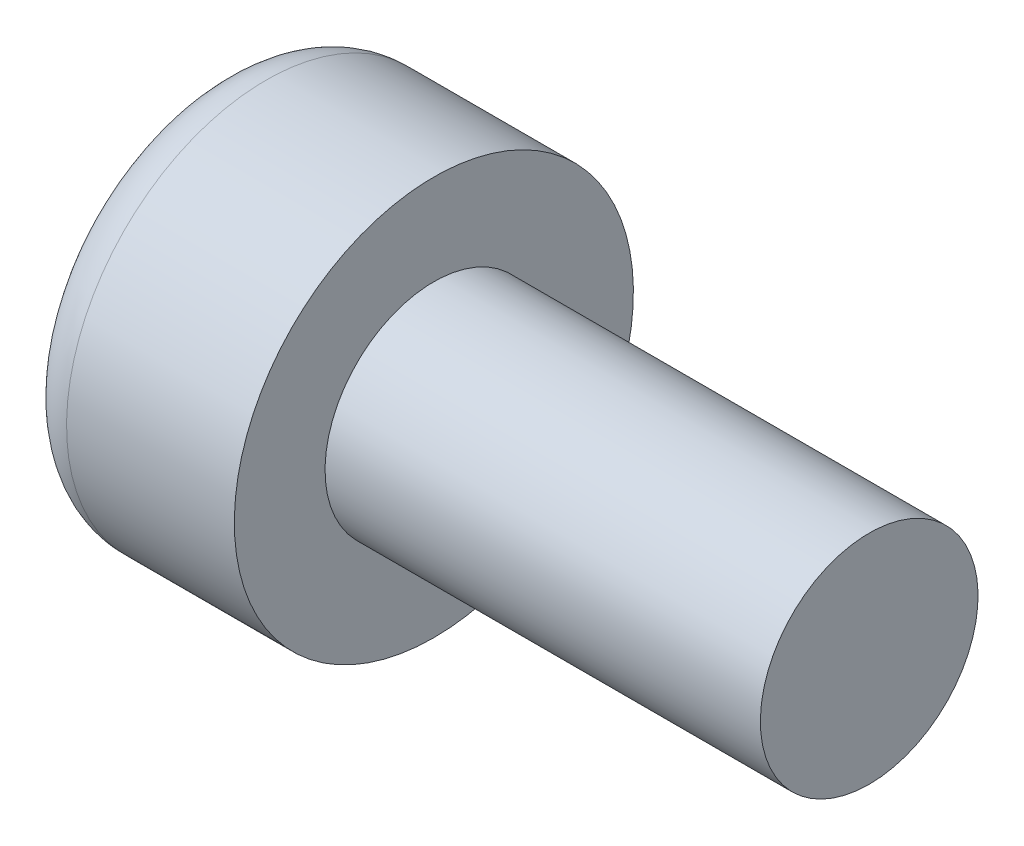
ISO-10303-21;
HEADER;
FILE_DESCRIPTION(('STEP AP214'),'2;1');
FILE_NAME('part.step','',(''),(''),'','','');
FILE_SCHEMA(('AUTOMOTIVE_DESIGN { 1 0 10303 214 1 1 1 1 }'));
ENDSEC;
DATA;
#1=APPLICATION_CONTEXT('core data for automotive mechanical design processes');
#2=APPLICATION_PROTOCOL_DEFINITION('international standard','automotive_design',2000,#1);
#3=PRODUCT_CONTEXT('',#1,'mechanical');
#4=PRODUCT('Part','Part','',(#3));
#5=PRODUCT_RELATED_PRODUCT_CATEGORY('part','',(#4));
#6=PRODUCT_DEFINITION_FORMATION('','',#4);
#7=PRODUCT_DEFINITION_CONTEXT('part definition',#1,'design');
#8=PRODUCT_DEFINITION('design','',#6,#7);
#9=PRODUCT_DEFINITION_SHAPE('','',#8);
#10=(LENGTH_UNIT() NAMED_UNIT(*) SI_UNIT(.MILLI.,.METRE.));
#11=(NAMED_UNIT(*) PLANE_ANGLE_UNIT() SI_UNIT($,.RADIAN.));
#12=(NAMED_UNIT(*) SI_UNIT($,.STERADIAN.) SOLID_ANGLE_UNIT());
#13=UNCERTAINTY_MEASURE_WITH_UNIT(LENGTH_MEASURE(1.E-05),#10,'distance_accuracy_value','');
#14=(GEOMETRIC_REPRESENTATION_CONTEXT(3) GLOBAL_UNCERTAINTY_ASSIGNED_CONTEXT((#13)) GLOBAL_UNIT_ASSIGNED_CONTEXT((#10,
#11,#12)) REPRESENTATION_CONTEXT('',''));
#15=CARTESIAN_POINT('',(0.,0.,0.));
#16=DIRECTION('',(0.,0.,1.));
#17=DIRECTION('',(1.,0.,0.));
#18=AXIS2_PLACEMENT_3D('',#15,#16,#17);
#19=CARTESIAN_POINT('',(0.,0.,0.));
#20=DIRECTION('',(1.,0.,0.));
#21=DIRECTION('',(0.,1.,0.));
#22=AXIS2_PLACEMENT_3D('',#19,#20,#21);
#23=PLANE('',#22);
#24=DIRECTION('',(0.,-0.5,-0.866025403784438));
#25=VECTOR('',#24,1.);
#26=CARTESIAN_POINT('',(0.,1.44337567297406,0.));
#27=LINE('',#26,#25);
#28=CARTESIAN_POINT('',(0.,1.44337567297406,0.));
#29=VERTEX_POINT('',#28);
#30=CARTESIAN_POINT('',(0.,0.721687836487031,-1.25));
#31=VERTEX_POINT('',#30);
#32=EDGE_CURVE('E121',#29,#31,#27,.T.);
#33=ORIENTED_EDGE('',*,*,#32,.F.);
#34=DIRECTION('',(0.,0.5,-0.866025403784439));
#35=VECTOR('',#34,1.);
#36=CARTESIAN_POINT('',(0.,0.721687836487032,1.25));
#37=LINE('',#36,#35);
#38=CARTESIAN_POINT('',(0.,0.721687836487032,1.25));
#39=VERTEX_POINT('',#38);
#40=EDGE_CURVE('E47',#39,#29,#37,.T.);
#41=ORIENTED_EDGE('',*,*,#40,.F.);
#42=DIRECTION('',(0.,1.,0.));
#43=VECTOR('',#42,1.);
#44=CARTESIAN_POINT('',(0.,-0.721687836487031,1.25));
#45=LINE('',#44,#43);
#46=CARTESIAN_POINT('',(0.,-0.721687836487031,1.25));
#47=VERTEX_POINT('',#46);
#48=EDGE_CURVE('E130',#47,#39,#45,.T.);
#49=ORIENTED_EDGE('',*,*,#48,.F.);
#50=DIRECTION('',(0.,0.5,0.866025403784439));
#51=VECTOR('',#50,1.);
#52=CARTESIAN_POINT('',(0.,-1.44337567297406,0.));
#53=LINE('',#52,#51);
#54=CARTESIAN_POINT('',(0.,-1.44337567297406,0.));
#55=VERTEX_POINT('',#54);
#56=EDGE_CURVE('E128',#55,#47,#53,.T.);
#57=ORIENTED_EDGE('',*,*,#56,.F.);
#58=DIRECTION('',(0.,-0.5,0.866025403784438));
#59=VECTOR('',#58,1.);
#60=CARTESIAN_POINT('',(0.,-0.721687836487032,-1.25));
#61=LINE('',#60,#59);
#62=CARTESIAN_POINT('',(0.,-0.721687836487032,-1.25));
#63=VERTEX_POINT('',#62);
#64=EDGE_CURVE('E95',#63,#55,#61,.T.);
#65=ORIENTED_EDGE('',*,*,#64,.F.);
#66=DIRECTION('',(0.,-1.,0.));
#67=VECTOR('',#66,1.);
#68=CARTESIAN_POINT('',(0.,0.721687836487031,-1.25));
#69=LINE('',#68,#67);
#70=EDGE_CURVE('E124',#31,#63,#69,.T.);
#71=ORIENTED_EDGE('',*,*,#70,.F.);
#72=EDGE_LOOP('',(#33,#41,#49,#57,#65,#71));
#73=FACE_BOUND('',#72,.T.);
#74=CARTESIAN_POINT('',(0.,0.,0.));
#75=DIRECTION('',(-1.,0.,0.));
#76=DIRECTION('',(0.,-1.,0.));
#77=AXIS2_PLACEMENT_3D('',#74,#75,#76);
#78=CIRCLE('',#77,2.0625);
#79=CARTESIAN_POINT('',(0.,-2.0625,0.));
#80=VERTEX_POINT('',#79);
#81=EDGE_CURVE('E11',#80,#80,#78,.T.);
#82=ORIENTED_EDGE('',*,*,#81,.T.);
#83=EDGE_LOOP('',(#82));
#84=FACE_BOUND('',#83,.T.);
#85=ADVANCED_FACE('F33',(#73,#84),#23,.F.);
#86=CARTESIAN_POINT('',(0.6875,0.,0.));
#87=DIRECTION('',(-1.,0.,0.));
#88=DIRECTION('',(0.,-1.,0.));
#89=AXIS2_PLACEMENT_3D('',#86,#87,#88);
#90=TOROIDAL_SURFACE('',#89,2.0625,0.6875);
#91=ORIENTED_EDGE('',*,*,#81,.F.);
#92=EDGE_LOOP('',(#91));
#93=FACE_BOUND('',#92,.T.);
#94=CARTESIAN_POINT('',(0.6875,0.,0.));
#95=DIRECTION('',(-1.,0.,0.));
#96=DIRECTION('',(0.,-1.,0.));
#97=AXIS2_PLACEMENT_3D('',#94,#95,#96);
#98=CIRCLE('',#97,2.75);
#99=CARTESIAN_POINT('',(0.687500000000001,-2.75,0.));
#100=VERTEX_POINT('',#99);
#101=EDGE_CURVE('E40',#100,#100,#98,.T.);
#102=ORIENTED_EDGE('',*,*,#101,.T.);
#103=EDGE_LOOP('',(#102));
#104=FACE_BOUND('',#103,.T.);
#105=ADVANCED_FACE('F150',(#93,#104),#90,.T.);
#106=CARTESIAN_POINT('',(0.,0.,0.));
#107=DIRECTION('',(-1.,0.,0.));
#108=DIRECTION('',(0.,-1.,0.));
#109=AXIS2_PLACEMENT_3D('',#106,#107,#108);
#110=CYLINDRICAL_SURFACE('',#109,2.75);
#111=ORIENTED_EDGE('',*,*,#101,.F.);
#112=EDGE_LOOP('',(#111));
#113=FACE_BOUND('',#112,.T.);
#114=CARTESIAN_POINT('',(3.,0.,0.));
#115=DIRECTION('',(-1.,0.,0.));
#116=DIRECTION('',(0.,-1.,0.));
#117=AXIS2_PLACEMENT_3D('',#114,#115,#116);
#118=CIRCLE('',#117,2.75);
#119=CARTESIAN_POINT('',(3.,-2.75,0.));
#120=VERTEX_POINT('',#119);
#121=EDGE_CURVE('E145',#120,#120,#118,.T.);
#122=ORIENTED_EDGE('',*,*,#121,.T.);
#123=EDGE_LOOP('',(#122));
#124=FACE_BOUND('',#123,.T.);
#125=ADVANCED_FACE('F152',(#113,#124),#110,.T.);
#126=CARTESIAN_POINT('',(3.,2.75,0.));
#127=DIRECTION('',(-1.,0.,0.));
#128=DIRECTION('',(0.,-1.,0.));
#129=AXIS2_PLACEMENT_3D('',#126,#127,#128);
#130=PLANE('',#129);
#131=ORIENTED_EDGE('',*,*,#121,.F.);
#132=EDGE_LOOP('',(#131));
#133=FACE_BOUND('',#132,.T.);
#134=CARTESIAN_POINT('',(3.,0.,0.));
#135=DIRECTION('',(-1.,0.,0.));
#136=DIRECTION('',(0.,-1.,0.));
#137=AXIS2_PLACEMENT_3D('',#134,#135,#136);
#138=CIRCLE('',#137,1.5);
#139=CARTESIAN_POINT('',(3.,-1.5,0.));
#140=VERTEX_POINT('',#139);
#141=EDGE_CURVE('E142',#140,#140,#138,.T.);
#142=ORIENTED_EDGE('',*,*,#141,.T.);
#143=EDGE_LOOP('',(#142));
#144=FACE_BOUND('',#143,.T.);
#145=ADVANCED_FACE('F155',(#133,#144),#130,.F.);
#146=CARTESIAN_POINT('',(0.,0.,0.));
#147=DIRECTION('',(-1.,0.,0.));
#148=DIRECTION('',(0.,-1.,0.));
#149=AXIS2_PLACEMENT_3D('',#146,#147,#148);
#150=CYLINDRICAL_SURFACE('',#149,1.5);
#151=ORIENTED_EDGE('',*,*,#141,.F.);
#152=EDGE_LOOP('',(#151));
#153=FACE_BOUND('',#152,.T.);
#154=CARTESIAN_POINT('',(9.,0.,0.));
#155=DIRECTION('',(-1.,0.,0.));
#156=DIRECTION('',(0.,-1.,0.));
#157=AXIS2_PLACEMENT_3D('',#154,#155,#156);
#158=CIRCLE('',#157,1.5);
#159=CARTESIAN_POINT('',(9.,-1.5,0.));
#160=VERTEX_POINT('',#159);
#161=EDGE_CURVE('E134',#160,#160,#158,.T.);
#162=ORIENTED_EDGE('',*,*,#161,.T.);
#163=EDGE_LOOP('',(#162));
#164=FACE_BOUND('',#163,.T.);
#165=ADVANCED_FACE('F161',(#153,#164),#150,.T.);
#166=CARTESIAN_POINT('',(9.,1.5,0.));
#167=DIRECTION('',(-1.,0.,0.));
#168=DIRECTION('',(0.,-1.,0.));
#169=AXIS2_PLACEMENT_3D('',#166,#167,#168);
#170=PLANE('',#169);
#171=ORIENTED_EDGE('',*,*,#161,.F.);
#172=EDGE_LOOP('',(#171));
#173=FACE_BOUND('',#172,.T.);
#174=ADVANCED_FACE('F167',(#173),#170,.F.);
#175=CARTESIAN_POINT('',(1.5,0.721687836487032,1.25));
#176=DIRECTION('',(0.,0.866025403784438,0.5));
#177=DIRECTION('',(0.,-0.5,0.866025403784439));
#178=AXIS2_PLACEMENT_3D('',#175,#176,#177);
#179=PLANE('',#178);
#180=ORIENTED_EDGE('',*,*,#40,.T.);
#181=DIRECTION('',(-1.,0.,0.));
#182=VECTOR('',#181,1.);
#183=CARTESIAN_POINT('',(1.5,1.44337567297406,0.));
#184=LINE('',#183,#182);
#185=CARTESIAN_POINT('',(1.5,1.44337567297406,0.));
#186=VERTEX_POINT('',#185);
#187=EDGE_CURVE('E77',#186,#29,#184,.T.);
#188=ORIENTED_EDGE('',*,*,#187,.F.);
#189=DIRECTION('',(0.,0.5,-0.866025403784439));
#190=VECTOR('',#189,1.);
#191=CARTESIAN_POINT('',(1.5,0.721687836487032,1.25));
#192=LINE('',#191,#190);
#193=CARTESIAN_POINT('',(1.5,0.721687836487032,1.25));
#194=VERTEX_POINT('',#193);
#195=EDGE_CURVE('E132',#194,#186,#192,.T.);
#196=ORIENTED_EDGE('',*,*,#195,.F.);
#197=DIRECTION('',(-1.,0.,0.));
#198=VECTOR('',#197,1.);
#199=CARTESIAN_POINT('',(1.5,0.721687836487032,1.25));
#200=LINE('',#199,#198);
#201=EDGE_CURVE('E55',#194,#39,#200,.T.);
#202=ORIENTED_EDGE('',*,*,#201,.T.);
#203=EDGE_LOOP('',(#180,#188,#196,#202));
#204=FACE_BOUND('',#203,.T.);
#205=ADVANCED_FACE('F172',(#204),#179,.F.);
#206=CARTESIAN_POINT('',(1.5,-0.721687836487031,1.25));
#207=DIRECTION('',(0.,0.,1.));
#208=DIRECTION('',(1.,0.,0.));
#209=AXIS2_PLACEMENT_3D('',#206,#207,#208);
#210=PLANE('',#209);
#211=ORIENTED_EDGE('',*,*,#48,.T.);
#212=ORIENTED_EDGE('',*,*,#201,.F.);
#213=DIRECTION('',(0.,1.,0.));
#214=VECTOR('',#213,1.);
#215=CARTESIAN_POINT('',(1.5,-0.721687836487031,1.25));
#216=LINE('',#215,#214);
#217=CARTESIAN_POINT('',(1.5,-0.721687836487031,1.25));
#218=VERTEX_POINT('',#217);
#219=EDGE_CURVE('E107',#218,#194,#216,.T.);
#220=ORIENTED_EDGE('',*,*,#219,.F.);
#221=DIRECTION('',(-1.,0.,0.));
#222=VECTOR('',#221,1.);
#223=CARTESIAN_POINT('',(1.5,-0.721687836487031,1.25));
#224=LINE('',#223,#222);
#225=EDGE_CURVE('E99',#218,#47,#224,.T.);
#226=ORIENTED_EDGE('',*,*,#225,.T.);
#227=EDGE_LOOP('',(#211,#212,#220,#226));
#228=FACE_BOUND('',#227,.T.);
#229=ADVANCED_FACE('F177',(#228),#210,.F.);
#230=CARTESIAN_POINT('',(1.5,-1.44337567297406,0.));
#231=DIRECTION('',(0.,-0.866025403784439,0.5));
#232=DIRECTION('',(0.,-0.5,-0.866025403784439));
#233=AXIS2_PLACEMENT_3D('',#230,#231,#232);
#234=PLANE('',#233);
#235=ORIENTED_EDGE('',*,*,#56,.T.);
#236=ORIENTED_EDGE('',*,*,#225,.F.);
#237=DIRECTION('',(0.,0.5,0.866025403784439));
#238=VECTOR('',#237,1.);
#239=CARTESIAN_POINT('',(1.5,-1.44337567297406,0.));
#240=LINE('',#239,#238);
#241=CARTESIAN_POINT('',(1.5,-1.44337567297406,0.));
#242=VERTEX_POINT('',#241);
#243=EDGE_CURVE('E103',#242,#218,#240,.T.);
#244=ORIENTED_EDGE('',*,*,#243,.F.);
#245=DIRECTION('',(-1.,0.,0.));
#246=VECTOR('',#245,1.);
#247=CARTESIAN_POINT('',(1.5,-1.44337567297406,0.));
#248=LINE('',#247,#246);
#249=EDGE_CURVE('E88',#242,#55,#248,.T.);
#250=ORIENTED_EDGE('',*,*,#249,.T.);
#251=EDGE_LOOP('',(#235,#236,#244,#250));
#252=FACE_BOUND('',#251,.T.);
#253=ADVANCED_FACE('F104',(#252),#234,.F.);
#254=CARTESIAN_POINT('',(1.5,-0.721687836487032,-1.25));
#255=DIRECTION('',(0.,-0.866025403784438,-0.5));
#256=DIRECTION('',(0.,0.5,-0.866025403784438));
#257=AXIS2_PLACEMENT_3D('',#254,#255,#256);
#258=PLANE('',#257);
#259=ORIENTED_EDGE('',*,*,#64,.T.);
#260=ORIENTED_EDGE('',*,*,#249,.F.);
#261=DIRECTION('',(0.,-0.5,0.866025403784438));
#262=VECTOR('',#261,1.);
#263=CARTESIAN_POINT('',(1.5,-0.721687836487032,-1.25));
#264=LINE('',#263,#262);
#265=CARTESIAN_POINT('',(1.5,-0.721687836487032,-1.25));
#266=VERTEX_POINT('',#265);
#267=EDGE_CURVE('E92',#266,#242,#264,.T.);
#268=ORIENTED_EDGE('',*,*,#267,.F.);
#269=DIRECTION('',(-1.,0.,0.));
#270=VECTOR('',#269,1.);
#271=CARTESIAN_POINT('',(1.5,-0.721687836487032,-1.25));
#272=LINE('',#271,#270);
#273=EDGE_CURVE('E100',#266,#63,#272,.T.);
#274=ORIENTED_EDGE('',*,*,#273,.T.);
#275=EDGE_LOOP('',(#259,#260,#268,#274));
#276=FACE_BOUND('',#275,.T.);
#277=ADVANCED_FACE('F90',(#276),#258,.F.);
#278=CARTESIAN_POINT('',(1.5,0.721687836487031,-1.25));
#279=DIRECTION('',(0.,0.,-1.));
#280=DIRECTION('',(-1.,0.,0.));
#281=AXIS2_PLACEMENT_3D('',#278,#279,#280);
#282=PLANE('',#281);
#283=ORIENTED_EDGE('',*,*,#70,.T.);
#284=ORIENTED_EDGE('',*,*,#273,.F.);
#285=DIRECTION('',(0.,-1.,0.));
#286=VECTOR('',#285,1.);
#287=CARTESIAN_POINT('',(1.5,0.721687836487031,-1.25));
#288=LINE('',#287,#286);
#289=CARTESIAN_POINT('',(1.5,0.721687836487031,-1.25));
#290=VERTEX_POINT('',#289);
#291=EDGE_CURVE('E113',#290,#266,#288,.T.);
#292=ORIENTED_EDGE('',*,*,#291,.F.);
#293=DIRECTION('',(-1.,0.,0.));
#294=VECTOR('',#293,1.);
#295=CARTESIAN_POINT('',(1.5,0.721687836487031,-1.25));
#296=LINE('',#295,#294);
#297=EDGE_CURVE('E137',#290,#31,#296,.T.);
#298=ORIENTED_EDGE('',*,*,#297,.T.);
#299=EDGE_LOOP('',(#283,#284,#292,#298));
#300=FACE_BOUND('',#299,.T.);
#301=ADVANCED_FACE('F203',(#300),#282,.F.);
#302=CARTESIAN_POINT('',(1.5,1.44337567297406,0.));
#303=DIRECTION('',(0.,0.866025403784438,-0.5));
#304=DIRECTION('',(0.,0.5,0.866025403784439));
#305=AXIS2_PLACEMENT_3D('',#302,#303,#304);
#306=PLANE('',#305);
#307=ORIENTED_EDGE('',*,*,#32,.T.);
#308=ORIENTED_EDGE('',*,*,#297,.F.);
#309=DIRECTION('',(0.,-0.5,-0.866025403784438));
#310=VECTOR('',#309,1.);
#311=CARTESIAN_POINT('',(1.5,1.44337567297406,0.));
#312=LINE('',#311,#310);
#313=EDGE_CURVE('E115',#186,#290,#312,.T.);
#314=ORIENTED_EDGE('',*,*,#313,.F.);
#315=ORIENTED_EDGE('',*,*,#187,.T.);
#316=EDGE_LOOP('',(#307,#308,#314,#315));
#317=FACE_BOUND('',#316,.T.);
#318=ADVANCED_FACE('F191',(#317),#306,.F.);
#319=CARTESIAN_POINT('',(1.5,0.,0.));
#320=DIRECTION('',(-1.,0.,0.));
#321=DIRECTION('',(0.,-1.,0.));
#322=AXIS2_PLACEMENT_3D('',#319,#320,#321);
#323=PLANE('',#322);
#324=ORIENTED_EDGE('',*,*,#195,.T.);
#325=ORIENTED_EDGE('',*,*,#313,.T.);
#326=ORIENTED_EDGE('',*,*,#291,.T.);
#327=ORIENTED_EDGE('',*,*,#267,.T.);
#328=ORIENTED_EDGE('',*,*,#243,.T.);
#329=ORIENTED_EDGE('',*,*,#219,.T.);
#330=EDGE_LOOP('',(#324,#325,#326,#327,#328,#329));
#331=FACE_BOUND('',#330,.T.);
#332=ADVANCED_FACE('F110',(#331),#323,.T.);
#333=CLOSED_SHELL('',(#85,#105,#125,#145,#165,#174,#205,#229,#253,#277,#301,#318,#332));
#334=MANIFOLD_SOLID_BREP('B2',#333);
#335=ADVANCED_BREP_SHAPE_REPRESENTATION('',(#18,#334),#14);
#336=SHAPE_DEFINITION_REPRESENTATION(#9,#335);
ENDSEC;
END-ISO-10303-21;
